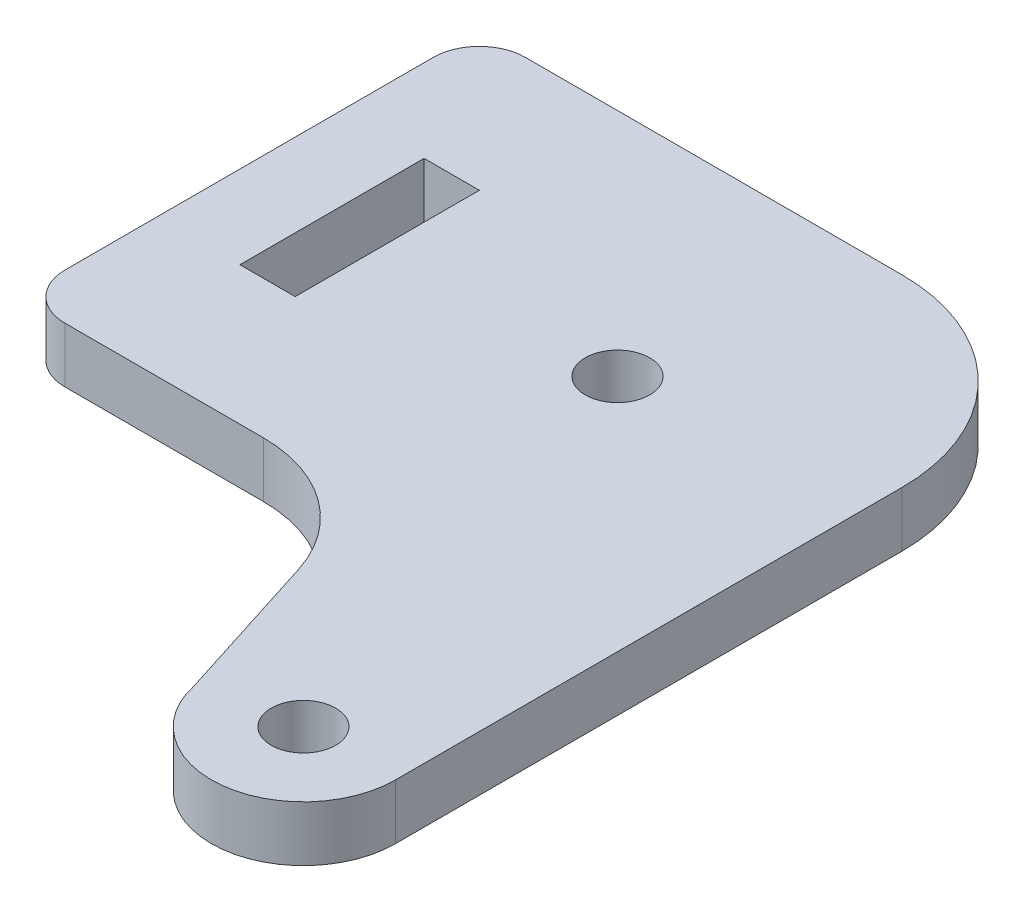
ISO-10303-21;
HEADER;
FILE_DESCRIPTION(('STEP AP214'),'2;1');
FILE_NAME('part.step','',(''),(''),'','','');
FILE_SCHEMA(('AUTOMOTIVE_DESIGN { 1 0 10303 214 1 1 1 1 }'));
ENDSEC;
DATA;
#1=APPLICATION_CONTEXT('core data for automotive mechanical design processes');
#2=APPLICATION_PROTOCOL_DEFINITION('international standard','automotive_design',2000,#1);
#3=PRODUCT_CONTEXT('',#1,'mechanical');
#4=PRODUCT('Part','Part','',(#3));
#5=PRODUCT_RELATED_PRODUCT_CATEGORY('part','',(#4));
#6=PRODUCT_DEFINITION_FORMATION('','',#4);
#7=PRODUCT_DEFINITION_CONTEXT('part definition',#1,'design');
#8=PRODUCT_DEFINITION('design','',#6,#7);
#9=PRODUCT_DEFINITION_SHAPE('','',#8);
#10=(LENGTH_UNIT() NAMED_UNIT(*) SI_UNIT(.MILLI.,.METRE.));
#11=(NAMED_UNIT(*) PLANE_ANGLE_UNIT() SI_UNIT($,.RADIAN.));
#12=(NAMED_UNIT(*) SI_UNIT($,.STERADIAN.) SOLID_ANGLE_UNIT());
#13=UNCERTAINTY_MEASURE_WITH_UNIT(LENGTH_MEASURE(1.E-05),#10,'distance_accuracy_value','');
#14=(GEOMETRIC_REPRESENTATION_CONTEXT(3) GLOBAL_UNCERTAINTY_ASSIGNED_CONTEXT((#13)) GLOBAL_UNIT_ASSIGNED_CONTEXT((#10,
#11,#12)) REPRESENTATION_CONTEXT('',''));
#15=CARTESIAN_POINT('',(0.,0.,0.));
#16=DIRECTION('',(0.,0.,1.));
#17=DIRECTION('',(1.,0.,0.));
#18=AXIS2_PLACEMENT_3D('',#15,#16,#17);
#19=CARTESIAN_POINT('',(-37.0517168291649,3.,25.));
#20=DIRECTION('',(0.,1.,0.));
#21=DIRECTION('',(0.,0.,1.));
#22=AXIS2_PLACEMENT_3D('',#19,#20,#21);
#23=PLANE('',#22);
#24=DIRECTION('',(-1.,0.,0.));
#25=VECTOR('',#24,1.);
#26=CARTESIAN_POINT('',(-60.5,3.,-5.));
#27=LINE('',#26,#25);
#28=CARTESIAN_POINT('',(-57.5,3.,-5.));
#29=VERTEX_POINT('',#28);
#30=CARTESIAN_POINT('',(-60.5,3.,-5.));
#31=VERTEX_POINT('',#30);
#32=EDGE_CURVE('E142',#29,#31,#27,.T.);
#33=ORIENTED_EDGE('',*,*,#32,.F.);
#34=DIRECTION('',(0.,0.,-1.));
#35=VECTOR('',#34,1.);
#36=CARTESIAN_POINT('',(-57.5,3.,5.));
#37=LINE('',#36,#35);
#38=CARTESIAN_POINT('',(-57.5,3.,5.));
#39=VERTEX_POINT('',#38);
#40=EDGE_CURVE('E134',#39,#29,#37,.T.);
#41=ORIENTED_EDGE('',*,*,#40,.F.);
#42=DIRECTION('',(1.,0.,0.));
#43=VECTOR('',#42,1.);
#44=CARTESIAN_POINT('',(-60.5,3.,5.));
#45=LINE('',#44,#43);
#46=CARTESIAN_POINT('',(-60.5,3.,5.));
#47=VERTEX_POINT('',#46);
#48=EDGE_CURVE('E157',#47,#39,#45,.T.);
#49=ORIENTED_EDGE('',*,*,#48,.F.);
#50=DIRECTION('',(0.,0.,1.));
#51=VECTOR('',#50,1.);
#52=CARTESIAN_POINT('',(-60.5,3.,5.));
#53=LINE('',#52,#51);
#54=EDGE_CURVE('E155',#31,#47,#53,.T.);
#55=ORIENTED_EDGE('',*,*,#54,.F.);
#56=EDGE_LOOP('',(#33,#41,#49,#55));
#57=FACE_BOUND('',#56,.T.);
#58=CARTESIAN_POINT('',(-37.0517168291649,3.,25.));
#59=DIRECTION('',(0.,1.,0.));
#60=DIRECTION('',(0.,0.,1.));
#61=AXIS2_PLACEMENT_3D('',#58,#59,#60);
#62=CIRCLE('',#61,1.75);
#63=CARTESIAN_POINT('',(-37.0517168291649,3.,26.75));
#64=VERTEX_POINT('',#63);
#65=EDGE_CURVE('E173',#64,#64,#62,.T.);
#66=ORIENTED_EDGE('',*,*,#65,.F.);
#67=EDGE_LOOP('',(#66));
#68=FACE_BOUND('',#67,.T.);
#69=CARTESIAN_POINT('',(-37.0517168291649,3.,25.));
#70=DIRECTION('',(0.,1.,0.));
#71=DIRECTION('',(0.,0.,1.));
#72=AXIS2_PLACEMENT_3D('',#69,#70,#71);
#73=CIRCLE('',#72,5.);
#74=CARTESIAN_POINT('',(-41.9435713720965,3.,26.0342916082032));
#75=VERTEX_POINT('',#74);
#76=CARTESIAN_POINT('',(-32.0517168291649,3.,25.));
#77=VERTEX_POINT('',#76);
#78=EDGE_CURVE('E179',#75,#77,#73,.T.);
#79=ORIENTED_EDGE('',*,*,#78,.T.);
#80=DIRECTION('',(0.,0.,-1.));
#81=VECTOR('',#80,1.);
#82=CARTESIAN_POINT('',(-32.0517168291649,3.,25.));
#83=LINE('',#82,#81);
#84=CARTESIAN_POINT('',(-32.0517168291649,3.,-2.5));
#85=VERTEX_POINT('',#84);
#86=EDGE_CURVE('E182',#77,#85,#83,.T.);
#87=ORIENTED_EDGE('',*,*,#86,.T.);
#88=CARTESIAN_POINT('',(-42.0517168291649,3.,-2.5));
#89=DIRECTION('',(0.,1.,0.));
#90=DIRECTION('',(0.,0.,1.));
#91=AXIS2_PLACEMENT_3D('',#88,#89,#90);
#92=CIRCLE('',#91,10.);
#93=CARTESIAN_POINT('',(-42.0517168291649,3.,-12.5));
#94=VERTEX_POINT('',#93);
#95=EDGE_CURVE('E185',#85,#94,#92,.T.);
#96=ORIENTED_EDGE('',*,*,#95,.T.);
#97=DIRECTION('',(-1.,0.,0.));
#98=VECTOR('',#97,1.);
#99=CARTESIAN_POINT('',(-62.5,3.,-12.5));
#100=LINE('',#99,#98);
#101=CARTESIAN_POINT('',(-62.5,3.,-12.5));
#102=VERTEX_POINT('',#101);
#103=EDGE_CURVE('E187',#94,#102,#100,.T.);
#104=ORIENTED_EDGE('',*,*,#103,.T.);
#105=CARTESIAN_POINT('',(-62.5,3.,-10.));
#106=DIRECTION('',(0.,1.,0.));
#107=DIRECTION('',(0.,0.,1.));
#108=AXIS2_PLACEMENT_3D('',#105,#106,#107);
#109=CIRCLE('',#108,2.5);
#110=CARTESIAN_POINT('',(-65.,3.,-10.));
#111=VERTEX_POINT('',#110);
#112=EDGE_CURVE('E189',#102,#111,#109,.T.);
#113=ORIENTED_EDGE('',*,*,#112,.T.);
#114=DIRECTION('',(0.,0.,1.));
#115=VECTOR('',#114,1.);
#116=CARTESIAN_POINT('',(-65.,3.,10.));
#117=LINE('',#116,#115);
#118=CARTESIAN_POINT('',(-65.,3.,10.));
#119=VERTEX_POINT('',#118);
#120=EDGE_CURVE('E191',#111,#119,#117,.T.);
#121=ORIENTED_EDGE('',*,*,#120,.T.);
#122=CARTESIAN_POINT('',(-62.5,3.,10.));
#123=DIRECTION('',(0.,1.,0.));
#124=DIRECTION('',(0.,0.,-1.));
#125=AXIS2_PLACEMENT_3D('',#122,#123,#124);
#126=CIRCLE('',#125,2.5);
#127=CARTESIAN_POINT('',(-62.5,3.,12.5));
#128=VERTEX_POINT('',#127);
#129=EDGE_CURVE('E193',#119,#128,#126,.T.);
#130=ORIENTED_EDGE('',*,*,#129,.T.);
#131=DIRECTION('',(1.,0.,0.));
#132=VECTOR('',#131,1.);
#133=CARTESIAN_POINT('',(-51.731989821255,3.,12.5));
#134=LINE('',#133,#132);
#135=CARTESIAN_POINT('',(-51.731989821255,3.,12.5));
#136=VERTEX_POINT('',#135);
#137=EDGE_CURVE('E195',#128,#136,#134,.T.);
#138=ORIENTED_EDGE('',*,*,#137,.T.);
#139=CARTESIAN_POINT('',(-51.731989821255,3.,20.));
#140=DIRECTION('',(0.,-1.,0.));
#141=DIRECTION('',(0.,0.,1.));
#142=AXIS2_PLACEMENT_3D('',#139,#140,#141);
#143=CIRCLE('',#142,7.5);
#144=CARTESIAN_POINT('',(-44.5845293614014,3.,17.7275984125095));
#145=VERTEX_POINT('',#144);
#146=EDGE_CURVE('E197',#136,#145,#143,.T.);
#147=ORIENTED_EDGE('',*,*,#146,.T.);
#148=DIRECTION('',(0.302986878332073,0.,0.952994727980478));
#149=VECTOR('',#148,1.);
#150=CARTESIAN_POINT('',(-41.9435713720965,3.,26.0342916082032));
#151=LINE('',#150,#149);
#152=EDGE_CURVE('E199',#145,#75,#151,.T.);
#153=ORIENTED_EDGE('',*,*,#152,.T.);
#154=EDGE_LOOP('',(#79,#87,#96,#104,#113,#121,#130,#138,#147,#153));
#155=FACE_BOUND('',#154,.T.);
#156=CARTESIAN_POINT('',(-45.,3.,0.));
#157=DIRECTION('',(0.,1.,0.));
#158=DIRECTION('',(0.,0.,1.));
#159=AXIS2_PLACEMENT_3D('',#156,#157,#158);
#160=CIRCLE('',#159,1.75);
#161=CARTESIAN_POINT('',(-45.,3.,1.75));
#162=VERTEX_POINT('',#161);
#163=EDGE_CURVE('E163',#162,#162,#160,.T.);
#164=ORIENTED_EDGE('',*,*,#163,.F.);
#165=EDGE_LOOP('',(#164));
#166=FACE_BOUND('',#165,.T.);
#167=ADVANCED_FACE('F33',(#57,#68,#155,#166),#23,.T.);
#168=CARTESIAN_POINT('',(-37.0517168291649,0.,25.));
#169=DIRECTION('',(0.,1.,0.));
#170=DIRECTION('',(0.,0.,1.));
#171=AXIS2_PLACEMENT_3D('',#168,#169,#170);
#172=PLANE('',#171);
#173=CARTESIAN_POINT('',(-37.0517168291649,0.,25.));
#174=DIRECTION('',(0.,1.,0.));
#175=DIRECTION('',(0.,0.,1.));
#176=AXIS2_PLACEMENT_3D('',#173,#174,#175);
#177=CIRCLE('',#176,1.75);
#178=CARTESIAN_POINT('',(-37.0517168291649,0.,26.75));
#179=VERTEX_POINT('',#178);
#180=EDGE_CURVE('E150',#179,#179,#177,.T.);
#181=ORIENTED_EDGE('',*,*,#180,.T.);
#182=EDGE_LOOP('',(#181));
#183=FACE_BOUND('',#182,.T.);
#184=CARTESIAN_POINT('',(-37.0517168291649,0.,25.));
#185=DIRECTION('',(0.,1.,0.));
#186=DIRECTION('',(0.,0.,1.));
#187=AXIS2_PLACEMENT_3D('',#184,#185,#186);
#188=CIRCLE('',#187,5.);
#189=CARTESIAN_POINT('',(-41.9435713720965,0.,26.0342916082032));
#190=VERTEX_POINT('',#189);
#191=CARTESIAN_POINT('',(-32.0517168291649,0.,25.));
#192=VERTEX_POINT('',#191);
#193=EDGE_CURVE('E176',#190,#192,#188,.T.);
#194=ORIENTED_EDGE('',*,*,#193,.F.);
#195=DIRECTION('',(0.302986878332073,0.,0.952994727980478));
#196=VECTOR('',#195,1.);
#197=CARTESIAN_POINT('',(-41.9435713720965,0.,26.0342916082032));
#198=LINE('',#197,#196);
#199=CARTESIAN_POINT('',(-44.5845293614014,0.,17.7275984125095));
#200=VERTEX_POINT('',#199);
#201=EDGE_CURVE('E183',#200,#190,#198,.T.);
#202=ORIENTED_EDGE('',*,*,#201,.F.);
#203=CARTESIAN_POINT('',(-51.731989821255,0.,20.));
#204=DIRECTION('',(0.,-1.,0.));
#205=DIRECTION('',(0.,0.,1.));
#206=AXIS2_PLACEMENT_3D('',#203,#204,#205);
#207=CIRCLE('',#206,7.5);
#208=CARTESIAN_POINT('',(-51.731989821255,0.,12.5));
#209=VERTEX_POINT('',#208);
#210=EDGE_CURVE('E218',#209,#200,#207,.T.);
#211=ORIENTED_EDGE('',*,*,#210,.F.);
#212=DIRECTION('',(1.,0.,0.));
#213=VECTOR('',#212,1.);
#214=CARTESIAN_POINT('',(-51.731989821255,0.,12.5));
#215=LINE('',#214,#213);
#216=CARTESIAN_POINT('',(-62.5,0.,12.5));
#217=VERTEX_POINT('',#216);
#218=EDGE_CURVE('E216',#217,#209,#215,.T.);
#219=ORIENTED_EDGE('',*,*,#218,.F.);
#220=CARTESIAN_POINT('',(-62.5,0.,10.));
#221=DIRECTION('',(0.,1.,0.));
#222=DIRECTION('',(0.,0.,-1.));
#223=AXIS2_PLACEMENT_3D('',#220,#221,#222);
#224=CIRCLE('',#223,2.5);
#225=CARTESIAN_POINT('',(-65.,0.,10.));
#226=VERTEX_POINT('',#225);
#227=EDGE_CURVE('E214',#226,#217,#224,.T.);
#228=ORIENTED_EDGE('',*,*,#227,.F.);
#229=DIRECTION('',(0.,0.,1.));
#230=VECTOR('',#229,1.);
#231=CARTESIAN_POINT('',(-65.,0.,10.));
#232=LINE('',#231,#230);
#233=CARTESIAN_POINT('',(-65.,0.,-10.));
#234=VERTEX_POINT('',#233);
#235=EDGE_CURVE('E212',#234,#226,#232,.T.);
#236=ORIENTED_EDGE('',*,*,#235,.F.);
#237=CARTESIAN_POINT('',(-62.5,0.,-10.));
#238=DIRECTION('',(0.,1.,0.));
#239=DIRECTION('',(0.,0.,1.));
#240=AXIS2_PLACEMENT_3D('',#237,#238,#239);
#241=CIRCLE('',#240,2.5);
#242=CARTESIAN_POINT('',(-62.5,0.,-12.5));
#243=VERTEX_POINT('',#242);
#244=EDGE_CURVE('E210',#243,#234,#241,.T.);
#245=ORIENTED_EDGE('',*,*,#244,.F.);
#246=DIRECTION('',(-1.,0.,0.));
#247=VECTOR('',#246,1.);
#248=CARTESIAN_POINT('',(-62.5,0.,-12.5));
#249=LINE('',#248,#247);
#250=CARTESIAN_POINT('',(-42.0517168291649,0.,-12.5));
#251=VERTEX_POINT('',#250);
#252=EDGE_CURVE('E208',#251,#243,#249,.T.);
#253=ORIENTED_EDGE('',*,*,#252,.F.);
#254=CARTESIAN_POINT('',(-42.0517168291649,0.,-2.5));
#255=DIRECTION('',(0.,1.,0.));
#256=DIRECTION('',(0.,0.,1.));
#257=AXIS2_PLACEMENT_3D('',#254,#255,#256);
#258=CIRCLE('',#257,10.);
#259=CARTESIAN_POINT('',(-32.0517168291649,0.,-2.5));
#260=VERTEX_POINT('',#259);
#261=EDGE_CURVE('E206',#260,#251,#258,.T.);
#262=ORIENTED_EDGE('',*,*,#261,.F.);
#263=DIRECTION('',(0.,0.,-1.));
#264=VECTOR('',#263,1.);
#265=CARTESIAN_POINT('',(-32.0517168291649,0.,25.));
#266=LINE('',#265,#264);
#267=EDGE_CURVE('E204',#192,#260,#266,.T.);
#268=ORIENTED_EDGE('',*,*,#267,.F.);
#269=EDGE_LOOP('',(#194,#202,#211,#219,#228,#236,#245,#253,#262,#268));
#270=FACE_BOUND('',#269,.T.);
#271=DIRECTION('',(0.,0.,-1.));
#272=VECTOR('',#271,1.);
#273=CARTESIAN_POINT('',(-57.5,0.,5.));
#274=LINE('',#273,#272);
#275=CARTESIAN_POINT('',(-57.5,0.,5.));
#276=VERTEX_POINT('',#275);
#277=CARTESIAN_POINT('',(-57.5,0.,-5.));
#278=VERTEX_POINT('',#277);
#279=EDGE_CURVE('E56',#276,#278,#274,.T.);
#280=ORIENTED_EDGE('',*,*,#279,.T.);
#281=DIRECTION('',(-1.,0.,0.));
#282=VECTOR('',#281,1.);
#283=CARTESIAN_POINT('',(-60.5,0.,-5.));
#284=LINE('',#283,#282);
#285=CARTESIAN_POINT('',(-60.5,0.,-5.));
#286=VERTEX_POINT('',#285);
#287=EDGE_CURVE('E149',#278,#286,#284,.T.);
#288=ORIENTED_EDGE('',*,*,#287,.T.);
#289=DIRECTION('',(0.,0.,1.));
#290=VECTOR('',#289,1.);
#291=CARTESIAN_POINT('',(-60.5,0.,5.));
#292=LINE('',#291,#290);
#293=CARTESIAN_POINT('',(-60.5,0.,5.));
#294=VERTEX_POINT('',#293);
#295=EDGE_CURVE('E165',#286,#294,#292,.T.);
#296=ORIENTED_EDGE('',*,*,#295,.T.);
#297=DIRECTION('',(1.,0.,0.));
#298=VECTOR('',#297,1.);
#299=CARTESIAN_POINT('',(-60.5,0.,5.));
#300=LINE('',#299,#298);
#301=EDGE_CURVE('E143',#294,#276,#300,.T.);
#302=ORIENTED_EDGE('',*,*,#301,.T.);
#303=EDGE_LOOP('',(#280,#288,#296,#302));
#304=FACE_BOUND('',#303,.T.);
#305=CARTESIAN_POINT('',(-45.,0.,0.));
#306=DIRECTION('',(0.,1.,0.));
#307=DIRECTION('',(0.,0.,1.));
#308=AXIS2_PLACEMENT_3D('',#305,#306,#307);
#309=CIRCLE('',#308,1.75);
#310=CARTESIAN_POINT('',(-45.,0.,1.75));
#311=VERTEX_POINT('',#310);
#312=EDGE_CURVE('E451',#311,#311,#309,.T.);
#313=ORIENTED_EDGE('',*,*,#312,.T.);
#314=EDGE_LOOP('',(#313));
#315=FACE_BOUND('',#314,.T.);
#316=ADVANCED_FACE('F254',(#183,#270,#304,#315),#172,.F.);
#317=CARTESIAN_POINT('',(-37.0517168291649,3.,25.));
#318=DIRECTION('',(0.,-1.,0.));
#319=DIRECTION('',(0.,0.,-1.));
#320=AXIS2_PLACEMENT_3D('',#317,#318,#319);
#321=CYLINDRICAL_SURFACE('',#320,5.);
#322=ORIENTED_EDGE('',*,*,#193,.T.);
#323=DIRECTION('',(0.,-1.,0.));
#324=VECTOR('',#323,1.);
#325=CARTESIAN_POINT('',(-32.0517168291649,3.,25.));
#326=LINE('',#325,#324);
#327=EDGE_CURVE('E11',#77,#192,#326,.T.);
#328=ORIENTED_EDGE('',*,*,#327,.F.);
#329=ORIENTED_EDGE('',*,*,#78,.F.);
#330=DIRECTION('',(0.,-1.,0.));
#331=VECTOR('',#330,1.);
#332=CARTESIAN_POINT('',(-41.9435713720965,3.,26.0342916082032));
#333=LINE('',#332,#331);
#334=EDGE_CURVE('E201',#75,#190,#333,.T.);
#335=ORIENTED_EDGE('',*,*,#334,.T.);
#336=EDGE_LOOP('',(#322,#328,#329,#335));
#337=FACE_BOUND('',#336,.T.);
#338=ADVANCED_FACE('F35',(#337),#321,.T.);
#339=CARTESIAN_POINT('',(-32.0517168291649,3.,25.));
#340=DIRECTION('',(-1.,0.,0.));
#341=DIRECTION('',(0.,0.,1.));
#342=AXIS2_PLACEMENT_3D('',#339,#340,#341);
#343=PLANE('',#342);
#344=ORIENTED_EDGE('',*,*,#267,.T.);
#345=DIRECTION('',(0.,-1.,0.));
#346=VECTOR('',#345,1.);
#347=CARTESIAN_POINT('',(-32.0517168291649,3.,-2.5));
#348=LINE('',#347,#346);
#349=EDGE_CURVE('E41',#85,#260,#348,.T.);
#350=ORIENTED_EDGE('',*,*,#349,.F.);
#351=ORIENTED_EDGE('',*,*,#86,.F.);
#352=ORIENTED_EDGE('',*,*,#327,.T.);
#353=EDGE_LOOP('',(#344,#350,#351,#352));
#354=FACE_BOUND('',#353,.T.);
#355=ADVANCED_FACE('F272',(#354),#343,.F.);
#356=CARTESIAN_POINT('',(-42.0517168291649,3.,-2.5));
#357=DIRECTION('',(0.,-1.,0.));
#358=DIRECTION('',(0.,0.,-1.));
#359=AXIS2_PLACEMENT_3D('',#356,#357,#358);
#360=CYLINDRICAL_SURFACE('',#359,10.);
#361=ORIENTED_EDGE('',*,*,#261,.T.);
#362=DIRECTION('',(0.,-1.,0.));
#363=VECTOR('',#362,1.);
#364=CARTESIAN_POINT('',(-42.0517168291649,3.,-12.5));
#365=LINE('',#364,#363);
#366=EDGE_CURVE('E241',#94,#251,#365,.T.);
#367=ORIENTED_EDGE('',*,*,#366,.F.);
#368=ORIENTED_EDGE('',*,*,#95,.F.);
#369=ORIENTED_EDGE('',*,*,#349,.T.);
#370=EDGE_LOOP('',(#361,#367,#368,#369));
#371=FACE_BOUND('',#370,.T.);
#372=ADVANCED_FACE('F248',(#371),#360,.T.);
#373=CARTESIAN_POINT('',(-62.5,3.,-12.5));
#374=DIRECTION('',(0.,0.,1.));
#375=DIRECTION('',(1.,0.,0.));
#376=AXIS2_PLACEMENT_3D('',#373,#374,#375);
#377=PLANE('',#376);
#378=ORIENTED_EDGE('',*,*,#252,.T.);
#379=DIRECTION('',(0.,-1.,0.));
#380=VECTOR('',#379,1.);
#381=CARTESIAN_POINT('',(-62.5,3.,-12.5));
#382=LINE('',#381,#380);
#383=EDGE_CURVE('E238',#102,#243,#382,.T.);
#384=ORIENTED_EDGE('',*,*,#383,.F.);
#385=ORIENTED_EDGE('',*,*,#103,.F.);
#386=ORIENTED_EDGE('',*,*,#366,.T.);
#387=EDGE_LOOP('',(#378,#384,#385,#386));
#388=FACE_BOUND('',#387,.T.);
#389=ADVANCED_FACE('F260',(#388),#377,.F.);
#390=CARTESIAN_POINT('',(-62.5,3.,-10.));
#391=DIRECTION('',(0.,-1.,0.));
#392=DIRECTION('',(0.,0.,-1.));
#393=AXIS2_PLACEMENT_3D('',#390,#391,#392);
#394=CYLINDRICAL_SURFACE('',#393,2.5);
#395=ORIENTED_EDGE('',*,*,#244,.T.);
#396=DIRECTION('',(0.,-1.,0.));
#397=VECTOR('',#396,1.);
#398=CARTESIAN_POINT('',(-65.,3.,-10.));
#399=LINE('',#398,#397);
#400=EDGE_CURVE('E235',#111,#234,#399,.T.);
#401=ORIENTED_EDGE('',*,*,#400,.F.);
#402=ORIENTED_EDGE('',*,*,#112,.F.);
#403=ORIENTED_EDGE('',*,*,#383,.T.);
#404=EDGE_LOOP('',(#395,#401,#402,#403));
#405=FACE_BOUND('',#404,.T.);
#406=ADVANCED_FACE('F264',(#405),#394,.T.);
#407=CARTESIAN_POINT('',(-65.,3.,10.));
#408=DIRECTION('',(1.,0.,0.));
#409=DIRECTION('',(0.,0.,-1.));
#410=AXIS2_PLACEMENT_3D('',#407,#408,#409);
#411=PLANE('',#410);
#412=ORIENTED_EDGE('',*,*,#235,.T.);
#413=DIRECTION('',(0.,-1.,0.));
#414=VECTOR('',#413,1.);
#415=CARTESIAN_POINT('',(-65.,3.,10.));
#416=LINE('',#415,#414);
#417=EDGE_CURVE('E232',#119,#226,#416,.T.);
#418=ORIENTED_EDGE('',*,*,#417,.F.);
#419=ORIENTED_EDGE('',*,*,#120,.F.);
#420=ORIENTED_EDGE('',*,*,#400,.T.);
#421=EDGE_LOOP('',(#412,#418,#419,#420));
#422=FACE_BOUND('',#421,.T.);
#423=ADVANCED_FACE('F295',(#422),#411,.F.);
#424=CARTESIAN_POINT('',(-62.5,3.,10.));
#425=DIRECTION('',(0.,-1.,0.));
#426=DIRECTION('',(0.,0.,-1.));
#427=AXIS2_PLACEMENT_3D('',#424,#425,#426);
#428=CYLINDRICAL_SURFACE('',#427,2.5);
#429=ORIENTED_EDGE('',*,*,#227,.T.);
#430=DIRECTION('',(0.,-1.,0.));
#431=VECTOR('',#430,1.);
#432=CARTESIAN_POINT('',(-62.5,3.,12.5));
#433=LINE('',#432,#431);
#434=EDGE_CURVE('E229',#128,#217,#433,.T.);
#435=ORIENTED_EDGE('',*,*,#434,.F.);
#436=ORIENTED_EDGE('',*,*,#129,.F.);
#437=ORIENTED_EDGE('',*,*,#417,.T.);
#438=EDGE_LOOP('',(#429,#435,#436,#437));
#439=FACE_BOUND('',#438,.T.);
#440=ADVANCED_FACE('F292',(#439),#428,.T.);
#441=CARTESIAN_POINT('',(-51.731989821255,3.,12.5));
#442=DIRECTION('',(0.,0.,-1.));
#443=DIRECTION('',(-1.,0.,0.));
#444=AXIS2_PLACEMENT_3D('',#441,#442,#443);
#445=PLANE('',#444);
#446=ORIENTED_EDGE('',*,*,#218,.T.);
#447=DIRECTION('',(0.,-1.,0.));
#448=VECTOR('',#447,1.);
#449=CARTESIAN_POINT('',(-51.731989821255,3.,12.5));
#450=LINE('',#449,#448);
#451=EDGE_CURVE('E226',#136,#209,#450,.T.);
#452=ORIENTED_EDGE('',*,*,#451,.F.);
#453=ORIENTED_EDGE('',*,*,#137,.F.);
#454=ORIENTED_EDGE('',*,*,#434,.T.);
#455=EDGE_LOOP('',(#446,#452,#453,#454));
#456=FACE_BOUND('',#455,.T.);
#457=ADVANCED_FACE('F288',(#456),#445,.F.);
#458=CARTESIAN_POINT('',(-51.731989821255,3.,20.));
#459=DIRECTION('',(0.,-1.,0.));
#460=DIRECTION('',(0.,0.,-1.));
#461=AXIS2_PLACEMENT_3D('',#458,#459,#460);
#462=CYLINDRICAL_SURFACE('',#461,7.5);
#463=ORIENTED_EDGE('',*,*,#210,.T.);
#464=DIRECTION('',(0.,-1.,0.));
#465=VECTOR('',#464,1.);
#466=CARTESIAN_POINT('',(-44.5845293614014,3.,17.7275984125095));
#467=LINE('',#466,#465);
#468=EDGE_CURVE('E223',#145,#200,#467,.T.);
#469=ORIENTED_EDGE('',*,*,#468,.F.);
#470=ORIENTED_EDGE('',*,*,#146,.F.);
#471=ORIENTED_EDGE('',*,*,#451,.T.);
#472=EDGE_LOOP('',(#463,#469,#470,#471));
#473=FACE_BOUND('',#472,.T.);
#474=ADVANCED_FACE('F284',(#473),#462,.F.);
#475=CARTESIAN_POINT('',(-41.9435713720965,3.,26.0342916082032));
#476=DIRECTION('',(0.952994727980478,0.,-0.302986878332073));
#477=DIRECTION('',(-0.302986878332073,0.,-0.952994727980478));
#478=AXIS2_PLACEMENT_3D('',#475,#476,#477);
#479=PLANE('',#478);
#480=ORIENTED_EDGE('',*,*,#201,.T.);
#481=ORIENTED_EDGE('',*,*,#334,.F.);
#482=ORIENTED_EDGE('',*,*,#152,.F.);
#483=ORIENTED_EDGE('',*,*,#468,.T.);
#484=EDGE_LOOP('',(#480,#481,#482,#483));
#485=FACE_BOUND('',#484,.T.);
#486=ADVANCED_FACE('F279',(#485),#479,.F.);
#487=CARTESIAN_POINT('',(-37.0517168291649,3.,25.));
#488=DIRECTION('',(0.,-1.,0.));
#489=DIRECTION('',(0.,0.,-1.));
#490=AXIS2_PLACEMENT_3D('',#487,#488,#489);
#491=CYLINDRICAL_SURFACE('',#490,1.75);
#492=ORIENTED_EDGE('',*,*,#65,.T.);
#493=EDGE_LOOP('',(#492));
#494=FACE_BOUND('',#493,.T.);
#495=ORIENTED_EDGE('',*,*,#180,.F.);
#496=EDGE_LOOP('',(#495));
#497=FACE_BOUND('',#496,.T.);
#498=ADVANCED_FACE('F312',(#494,#497),#491,.F.);
#499=CARTESIAN_POINT('',(-57.5,3.,5.));
#500=DIRECTION('',(-1.,0.,0.));
#501=DIRECTION('',(0.,0.,1.));
#502=AXIS2_PLACEMENT_3D('',#499,#500,#501);
#503=PLANE('',#502);
#504=ORIENTED_EDGE('',*,*,#279,.F.);
#505=DIRECTION('',(0.,-1.,0.));
#506=VECTOR('',#505,1.);
#507=CARTESIAN_POINT('',(-57.5,3.,5.));
#508=LINE('',#507,#506);
#509=EDGE_CURVE('E138',#39,#276,#508,.T.);
#510=ORIENTED_EDGE('',*,*,#509,.F.);
#511=ORIENTED_EDGE('',*,*,#40,.T.);
#512=DIRECTION('',(0.,-1.,0.));
#513=VECTOR('',#512,1.);
#514=CARTESIAN_POINT('',(-57.5,3.,-5.));
#515=LINE('',#514,#513);
#516=EDGE_CURVE('E137',#29,#278,#515,.T.);
#517=ORIENTED_EDGE('',*,*,#516,.T.);
#518=EDGE_LOOP('',(#504,#510,#511,#517));
#519=FACE_BOUND('',#518,.T.);
#520=ADVANCED_FACE('F136',(#519),#503,.T.);
#521=CARTESIAN_POINT('',(-60.5,3.,-5.));
#522=DIRECTION('',(0.,0.,1.));
#523=DIRECTION('',(1.,0.,0.));
#524=AXIS2_PLACEMENT_3D('',#521,#522,#523);
#525=PLANE('',#524);
#526=ORIENTED_EDGE('',*,*,#287,.F.);
#527=ORIENTED_EDGE('',*,*,#516,.F.);
#528=ORIENTED_EDGE('',*,*,#32,.T.);
#529=DIRECTION('',(0.,-1.,0.));
#530=VECTOR('',#529,1.);
#531=CARTESIAN_POINT('',(-60.5,3.,-5.));
#532=LINE('',#531,#530);
#533=EDGE_CURVE('E151',#31,#286,#532,.T.);
#534=ORIENTED_EDGE('',*,*,#533,.T.);
#535=EDGE_LOOP('',(#526,#527,#528,#534));
#536=FACE_BOUND('',#535,.T.);
#537=ADVANCED_FACE('F146',(#536),#525,.T.);
#538=CARTESIAN_POINT('',(-60.5,3.,5.));
#539=DIRECTION('',(1.,0.,0.));
#540=DIRECTION('',(0.,0.,-1.));
#541=AXIS2_PLACEMENT_3D('',#538,#539,#540);
#542=PLANE('',#541);
#543=ORIENTED_EDGE('',*,*,#295,.F.);
#544=ORIENTED_EDGE('',*,*,#533,.F.);
#545=ORIENTED_EDGE('',*,*,#54,.T.);
#546=DIRECTION('',(0.,-1.,0.));
#547=VECTOR('',#546,1.);
#548=CARTESIAN_POINT('',(-60.5,3.,5.));
#549=LINE('',#548,#547);
#550=EDGE_CURVE('E48',#47,#294,#549,.T.);
#551=ORIENTED_EDGE('',*,*,#550,.T.);
#552=EDGE_LOOP('',(#543,#544,#545,#551));
#553=FACE_BOUND('',#552,.T.);
#554=ADVANCED_FACE('F349',(#553),#542,.T.);
#555=CARTESIAN_POINT('',(-60.5,3.,5.));
#556=DIRECTION('',(0.,0.,-1.));
#557=DIRECTION('',(-1.,0.,0.));
#558=AXIS2_PLACEMENT_3D('',#555,#556,#557);
#559=PLANE('',#558);
#560=ORIENTED_EDGE('',*,*,#301,.F.);
#561=ORIENTED_EDGE('',*,*,#550,.F.);
#562=ORIENTED_EDGE('',*,*,#48,.T.);
#563=ORIENTED_EDGE('',*,*,#509,.T.);
#564=EDGE_LOOP('',(#560,#561,#562,#563));
#565=FACE_BOUND('',#564,.T.);
#566=ADVANCED_FACE('F356',(#565),#559,.T.);
#567=CARTESIAN_POINT('',(-45.,3.,0.));
#568=DIRECTION('',(0.,-1.,0.));
#569=DIRECTION('',(0.,0.,-1.));
#570=AXIS2_PLACEMENT_3D('',#567,#568,#569);
#571=CYLINDRICAL_SURFACE('',#570,1.75);
#572=ORIENTED_EDGE('',*,*,#163,.T.);
#573=EDGE_LOOP('',(#572));
#574=FACE_BOUND('',#573,.T.);
#575=ORIENTED_EDGE('',*,*,#312,.F.);
#576=EDGE_LOOP('',(#575));
#577=FACE_BOUND('',#576,.T.);
#578=ADVANCED_FACE('F364',(#574,#577),#571,.F.);
#579=CLOSED_SHELL('',(#167,#316,#338,#355,#372,#389,#406,#423,#440,#457,#474,#486,#498,#520,
#537,#554,#566,#578));
#580=MANIFOLD_SOLID_BREP('B2',#579);
#581=ADVANCED_BREP_SHAPE_REPRESENTATION('',(#18,#580),#14);
#582=SHAPE_DEFINITION_REPRESENTATION(#9,#581);
ENDSEC;
END-ISO-10303-21;
